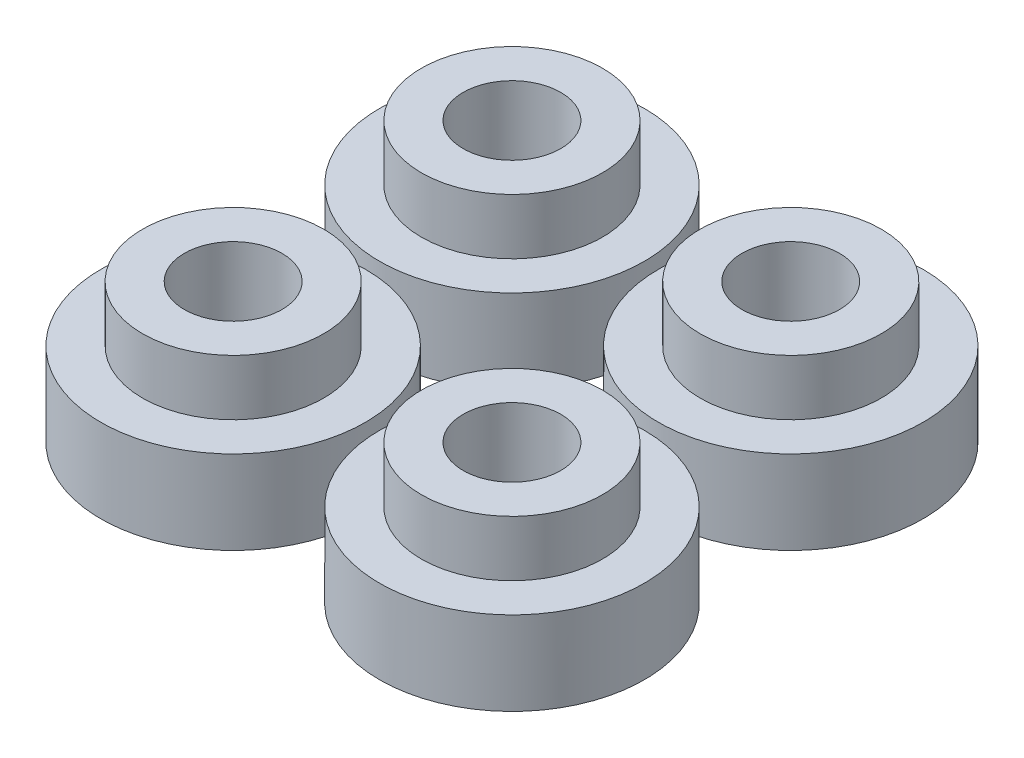
ISO-10303-21;
HEADER;
FILE_DESCRIPTION(('STEP AP214'),'2;1');
FILE_NAME('part.step','',(''),(''),'','','');
FILE_SCHEMA(('AUTOMOTIVE_DESIGN { 1 0 10303 214 1 1 1 1 }'));
ENDSEC;
DATA;
#1=APPLICATION_CONTEXT('core data for automotive mechanical design processes');
#2=APPLICATION_PROTOCOL_DEFINITION('international standard','automotive_design',2000,#1);
#3=PRODUCT_CONTEXT('',#1,'mechanical');
#4=PRODUCT('Part','Part','',(#3));
#5=PRODUCT_RELATED_PRODUCT_CATEGORY('part','',(#4));
#6=PRODUCT_DEFINITION_FORMATION('','',#4);
#7=PRODUCT_DEFINITION_CONTEXT('part definition',#1,'design');
#8=PRODUCT_DEFINITION('design','',#6,#7);
#9=PRODUCT_DEFINITION_SHAPE('','',#8);
#10=(LENGTH_UNIT() NAMED_UNIT(*) SI_UNIT(.MILLI.,.METRE.));
#11=(NAMED_UNIT(*) PLANE_ANGLE_UNIT() SI_UNIT($,.RADIAN.));
#12=(NAMED_UNIT(*) SI_UNIT($,.STERADIAN.) SOLID_ANGLE_UNIT());
#13=UNCERTAINTY_MEASURE_WITH_UNIT(LENGTH_MEASURE(1.E-05),#10,'distance_accuracy_value','');
#14=(GEOMETRIC_REPRESENTATION_CONTEXT(3) GLOBAL_UNCERTAINTY_ASSIGNED_CONTEXT((#13)) GLOBAL_UNIT_ASSIGNED_CONTEXT((#10,
#11,#12)) REPRESENTATION_CONTEXT('',''));
#15=CARTESIAN_POINT('',(0.,0.,0.));
#16=DIRECTION('',(0.,0.,1.));
#17=DIRECTION('',(1.,0.,0.));
#18=AXIS2_PLACEMENT_3D('',#15,#16,#17);
#19=CARTESIAN_POINT('',(4.75,0.,0.));
#20=DIRECTION('',(0.,-1.,0.));
#21=DIRECTION('',(0.,0.,-1.));
#22=AXIS2_PLACEMENT_3D('',#19,#20,#21);
#23=PLANE('',#22);
#24=CARTESIAN_POINT('',(0.,0.,0.));
#25=DIRECTION('',(0.,-1.,0.));
#26=DIRECTION('',(0.,0.,-1.));
#27=AXIS2_PLACEMENT_3D('',#24,#25,#26);
#28=CIRCLE('',#27,1.75);
#29=CARTESIAN_POINT('',(0.,0.,-1.75));
#30=VERTEX_POINT('',#29);
#31=EDGE_CURVE('E59',#30,#30,#28,.T.);
#32=ORIENTED_EDGE('',*,*,#31,.F.);
#33=EDGE_LOOP('',(#32));
#34=FACE_BOUND('',#33,.T.);
#35=CARTESIAN_POINT('',(0.,0.,0.));
#36=DIRECTION('',(0.,-1.,0.));
#37=DIRECTION('',(0.,0.,-1.));
#38=AXIS2_PLACEMENT_3D('',#35,#36,#37);
#39=CIRCLE('',#38,4.75);
#40=CARTESIAN_POINT('',(0.,0.,-4.75));
#41=VERTEX_POINT('',#40);
#42=EDGE_CURVE('E43',#41,#41,#39,.T.);
#43=ORIENTED_EDGE('',*,*,#42,.T.);
#44=EDGE_LOOP('',(#43));
#45=FACE_BOUND('',#44,.T.);
#46=ADVANCED_FACE('F39',(#34,#45),#23,.T.);
#47=CARTESIAN_POINT('',(0.,0.,0.));
#48=DIRECTION('',(0.,-1.,0.));
#49=DIRECTION('',(0.,0.,-1.));
#50=AXIS2_PLACEMENT_3D('',#47,#48,#49);
#51=CYLINDRICAL_SURFACE('',#50,1.75);
#52=ORIENTED_EDGE('',*,*,#31,.T.);
#53=EDGE_LOOP('',(#52));
#54=FACE_BOUND('',#53,.T.);
#55=CARTESIAN_POINT('',(0.,5.,0.));
#56=DIRECTION('',(0.,-1.,0.));
#57=DIRECTION('',(0.,0.,-1.));
#58=AXIS2_PLACEMENT_3D('',#55,#56,#57);
#59=CIRCLE('',#58,1.75);
#60=CARTESIAN_POINT('',(0.,5.,-1.75));
#61=VERTEX_POINT('',#60);
#62=EDGE_CURVE('E56',#61,#61,#59,.T.);
#63=ORIENTED_EDGE('',*,*,#62,.F.);
#64=EDGE_LOOP('',(#63));
#65=FACE_BOUND('',#64,.T.);
#66=ADVANCED_FACE('F75',(#54,#65),#51,.F.);
#67=CARTESIAN_POINT('',(1.75,5.,0.));
#68=DIRECTION('',(0.,1.,0.));
#69=DIRECTION('',(0.,0.,1.));
#70=AXIS2_PLACEMENT_3D('',#67,#68,#69);
#71=PLANE('',#70);
#72=ORIENTED_EDGE('',*,*,#62,.T.);
#73=EDGE_LOOP('',(#72));
#74=FACE_BOUND('',#73,.T.);
#75=CARTESIAN_POINT('',(0.,5.,0.));
#76=DIRECTION('',(0.,-1.,0.));
#77=DIRECTION('',(0.,0.,-1.));
#78=AXIS2_PLACEMENT_3D('',#75,#76,#77);
#79=CIRCLE('',#78,3.25);
#80=CARTESIAN_POINT('',(0.,5.,-3.25));
#81=VERTEX_POINT('',#80);
#82=EDGE_CURVE('E51',#81,#81,#79,.T.);
#83=ORIENTED_EDGE('',*,*,#82,.F.);
#84=EDGE_LOOP('',(#83));
#85=FACE_BOUND('',#84,.T.);
#86=ADVANCED_FACE('F81',(#74,#85),#71,.T.);
#87=CARTESIAN_POINT('',(0.,0.,0.));
#88=DIRECTION('',(0.,-1.,0.));
#89=DIRECTION('',(0.,0.,-1.));
#90=AXIS2_PLACEMENT_3D('',#87,#88,#89);
#91=CYLINDRICAL_SURFACE('',#90,3.25);
#92=ORIENTED_EDGE('',*,*,#82,.T.);
#93=EDGE_LOOP('',(#92));
#94=FACE_BOUND('',#93,.T.);
#95=CARTESIAN_POINT('',(0.,3.,0.));
#96=DIRECTION('',(0.,-1.,0.));
#97=DIRECTION('',(0.,0.,-1.));
#98=AXIS2_PLACEMENT_3D('',#95,#96,#97);
#99=CIRCLE('',#98,3.25);
#100=CARTESIAN_POINT('',(0.,3.,-3.25));
#101=VERTEX_POINT('',#100);
#102=EDGE_CURVE('E47',#101,#101,#99,.T.);
#103=ORIENTED_EDGE('',*,*,#102,.F.);
#104=EDGE_LOOP('',(#103));
#105=FACE_BOUND('',#104,.T.);
#106=ADVANCED_FACE('F72',(#94,#105),#91,.T.);
#107=CARTESIAN_POINT('',(3.25,3.,0.));
#108=DIRECTION('',(0.,1.,0.));
#109=DIRECTION('',(0.,0.,1.));
#110=AXIS2_PLACEMENT_3D('',#107,#108,#109);
#111=PLANE('',#110);
#112=ORIENTED_EDGE('',*,*,#102,.T.);
#113=EDGE_LOOP('',(#112));
#114=FACE_BOUND('',#113,.T.);
#115=CARTESIAN_POINT('',(0.,3.,0.));
#116=DIRECTION('',(0.,-1.,0.));
#117=DIRECTION('',(0.,0.,-1.));
#118=AXIS2_PLACEMENT_3D('',#115,#116,#117);
#119=CIRCLE('',#118,4.75);
#120=CARTESIAN_POINT('',(0.,3.,-4.75));
#121=VERTEX_POINT('',#120);
#122=EDGE_CURVE('E11',#121,#121,#119,.T.);
#123=ORIENTED_EDGE('',*,*,#122,.F.);
#124=EDGE_LOOP('',(#123));
#125=FACE_BOUND('',#124,.T.);
#126=ADVANCED_FACE('F68',(#114,#125),#111,.T.);
#127=CARTESIAN_POINT('',(0.,0.,0.));
#128=DIRECTION('',(0.,-1.,0.));
#129=DIRECTION('',(0.,0.,-1.));
#130=AXIS2_PLACEMENT_3D('',#127,#128,#129);
#131=CYLINDRICAL_SURFACE('',#130,4.75);
#132=ORIENTED_EDGE('',*,*,#122,.T.);
#133=EDGE_LOOP('',(#132));
#134=FACE_BOUND('',#133,.T.);
#135=ORIENTED_EDGE('',*,*,#42,.F.);
#136=EDGE_LOOP('',(#135));
#137=FACE_BOUND('',#136,.T.);
#138=ADVANCED_FACE('F41',(#134,#137),#131,.T.);
#139=CLOSED_SHELL('',(#46,#66,#86,#106,#126,#138));
#140=MANIFOLD_SOLID_BREP('B2',#139);
#141=CARTESIAN_POINT('',(10.,0.,10.));
#142=DIRECTION('',(0.,-1.,0.));
#143=DIRECTION('',(0.,0.,-1.));
#144=AXIS2_PLACEMENT_3D('',#141,#142,#143);
#145=CYLINDRICAL_SURFACE('',#144,3.25);
#146=CARTESIAN_POINT('',(10.,5.,10.));
#147=DIRECTION('',(0.,-1.,0.));
#148=DIRECTION('',(0.,0.,-1.));
#149=AXIS2_PLACEMENT_3D('',#146,#147,#148);
#150=CIRCLE('',#149,3.25);
#151=CARTESIAN_POINT('',(10.,5.,6.75));
#152=VERTEX_POINT('',#151);
#153=EDGE_CURVE('E161',#152,#152,#150,.T.);
#154=ORIENTED_EDGE('',*,*,#153,.T.);
#155=EDGE_LOOP('',(#154));
#156=FACE_BOUND('',#155,.T.);
#157=CARTESIAN_POINT('',(10.,3.,10.));
#158=DIRECTION('',(0.,-1.,0.));
#159=DIRECTION('',(0.,0.,-1.));
#160=AXIS2_PLACEMENT_3D('',#157,#158,#159);
#161=CIRCLE('',#160,3.25);
#162=CARTESIAN_POINT('',(10.,3.,6.75));
#163=VERTEX_POINT('',#162);
#164=EDGE_CURVE('E157',#163,#163,#161,.T.);
#165=ORIENTED_EDGE('',*,*,#164,.F.);
#166=EDGE_LOOP('',(#165));
#167=FACE_BOUND('',#166,.T.);
#168=ADVANCED_FACE('F141',(#156,#167),#145,.T.);
#169=CARTESIAN_POINT('',(11.75,5.,10.));
#170=DIRECTION('',(0.,1.,0.));
#171=DIRECTION('',(0.,0.,1.));
#172=AXIS2_PLACEMENT_3D('',#169,#170,#171);
#173=PLANE('',#172);
#174=CARTESIAN_POINT('',(10.,5.,10.));
#175=DIRECTION('',(0.,-1.,0.));
#176=DIRECTION('',(0.,0.,-1.));
#177=AXIS2_PLACEMENT_3D('',#174,#175,#176);
#178=CIRCLE('',#177,1.75);
#179=CARTESIAN_POINT('',(10.,5.,8.25));
#180=VERTEX_POINT('',#179);
#181=EDGE_CURVE('E158',#180,#180,#178,.T.);
#182=ORIENTED_EDGE('',*,*,#181,.T.);
#183=EDGE_LOOP('',(#182));
#184=FACE_BOUND('',#183,.T.);
#185=ORIENTED_EDGE('',*,*,#153,.F.);
#186=EDGE_LOOP('',(#185));
#187=FACE_BOUND('',#186,.T.);
#188=ADVANCED_FACE('F170',(#184,#187),#173,.T.);
#189=CARTESIAN_POINT('',(13.25,3.,10.));
#190=DIRECTION('',(0.,1.,0.));
#191=DIRECTION('',(0.,0.,1.));
#192=AXIS2_PLACEMENT_3D('',#189,#190,#191);
#193=PLANE('',#192);
#194=ORIENTED_EDGE('',*,*,#164,.T.);
#195=EDGE_LOOP('',(#194));
#196=FACE_BOUND('',#195,.T.);
#197=CARTESIAN_POINT('',(10.,3.,10.));
#198=DIRECTION('',(0.,-1.,0.));
#199=DIRECTION('',(0.,0.,-1.));
#200=AXIS2_PLACEMENT_3D('',#197,#198,#199);
#201=CIRCLE('',#200,4.75);
#202=CARTESIAN_POINT('',(10.,3.,5.25));
#203=VERTEX_POINT('',#202);
#204=EDGE_CURVE('E145',#203,#203,#201,.T.);
#205=ORIENTED_EDGE('',*,*,#204,.F.);
#206=EDGE_LOOP('',(#205));
#207=FACE_BOUND('',#206,.T.);
#208=ADVANCED_FACE('F166',(#196,#207),#193,.T.);
#209=CARTESIAN_POINT('',(10.,0.,10.));
#210=DIRECTION('',(0.,-1.,0.));
#211=DIRECTION('',(0.,0.,-1.));
#212=AXIS2_PLACEMENT_3D('',#209,#210,#211);
#213=CYLINDRICAL_SURFACE('',#212,1.75);
#214=CARTESIAN_POINT('',(10.,0.,10.));
#215=DIRECTION('',(0.,-1.,0.));
#216=DIRECTION('',(0.,0.,-1.));
#217=AXIS2_PLACEMENT_3D('',#214,#215,#216);
#218=CIRCLE('',#217,1.75);
#219=CARTESIAN_POINT('',(10.,0.,8.25));
#220=VERTEX_POINT('',#219);
#221=EDGE_CURVE('E153',#220,#220,#218,.T.);
#222=ORIENTED_EDGE('',*,*,#221,.T.);
#223=EDGE_LOOP('',(#222));
#224=FACE_BOUND('',#223,.T.);
#225=ORIENTED_EDGE('',*,*,#181,.F.);
#226=EDGE_LOOP('',(#225));
#227=FACE_BOUND('',#226,.T.);
#228=ADVANCED_FACE('F180',(#224,#227),#213,.F.);
#229=CARTESIAN_POINT('',(10.,0.,10.));
#230=DIRECTION('',(0.,-1.,0.));
#231=DIRECTION('',(0.,0.,-1.));
#232=AXIS2_PLACEMENT_3D('',#229,#230,#231);
#233=CYLINDRICAL_SURFACE('',#232,4.75);
#234=ORIENTED_EDGE('',*,*,#204,.T.);
#235=EDGE_LOOP('',(#234));
#236=FACE_BOUND('',#235,.T.);
#237=CARTESIAN_POINT('',(10.,0.,10.));
#238=DIRECTION('',(0.,1.,0.));
#239=DIRECTION('',(0.,0.,1.));
#240=AXIS2_PLACEMENT_3D('',#237,#238,#239);
#241=CIRCLE('',#240,4.75);
#242=CARTESIAN_POINT('',(10.,0.,14.75));
#243=VERTEX_POINT('',#242);
#244=EDGE_CURVE('E38',#243,#243,#241,.T.);
#245=ORIENTED_EDGE('',*,*,#244,.T.);
#246=EDGE_LOOP('',(#245));
#247=FACE_BOUND('',#246,.T.);
#248=ADVANCED_FACE('F143',(#236,#247),#233,.T.);
#249=CARTESIAN_POINT('',(14.75,0.,10.));
#250=DIRECTION('',(0.,-1.,0.));
#251=DIRECTION('',(0.,0.,-1.));
#252=AXIS2_PLACEMENT_3D('',#249,#250,#251);
#253=PLANE('',#252);
#254=ORIENTED_EDGE('',*,*,#244,.F.);
#255=EDGE_LOOP('',(#254));
#256=FACE_BOUND('',#255,.T.);
#257=ORIENTED_EDGE('',*,*,#221,.F.);
#258=EDGE_LOOP('',(#257));
#259=FACE_BOUND('',#258,.T.);
#260=ADVANCED_FACE('F188',(#256,#259),#253,.T.);
#261=CLOSED_SHELL('',(#168,#188,#208,#228,#248,#260));
#262=MANIFOLD_SOLID_BREP('B6',#261);
#263=CARTESIAN_POINT('',(0.,0.,10.));
#264=DIRECTION('',(0.,-1.,0.));
#265=DIRECTION('',(0.,0.,-1.));
#266=AXIS2_PLACEMENT_3D('',#263,#264,#265);
#267=CYLINDRICAL_SURFACE('',#266,3.25);
#268=CARTESIAN_POINT('',(0.,5.,10.));
#269=DIRECTION('',(0.,-1.,0.));
#270=DIRECTION('',(0.,0.,-1.));
#271=AXIS2_PLACEMENT_3D('',#268,#269,#270);
#272=CIRCLE('',#271,3.25);
#273=CARTESIAN_POINT('',(0.,5.,6.75));
#274=VERTEX_POINT('',#273);
#275=EDGE_CURVE('E263',#274,#274,#272,.T.);
#276=ORIENTED_EDGE('',*,*,#275,.T.);
#277=EDGE_LOOP('',(#276));
#278=FACE_BOUND('',#277,.T.);
#279=CARTESIAN_POINT('',(0.,3.,10.));
#280=DIRECTION('',(0.,-1.,0.));
#281=DIRECTION('',(0.,0.,-1.));
#282=AXIS2_PLACEMENT_3D('',#279,#280,#281);
#283=CIRCLE('',#282,3.25);
#284=CARTESIAN_POINT('',(0.,3.,6.75));
#285=VERTEX_POINT('',#284);
#286=EDGE_CURVE('E258',#285,#285,#283,.T.);
#287=ORIENTED_EDGE('',*,*,#286,.F.);
#288=EDGE_LOOP('',(#287));
#289=FACE_BOUND('',#288,.T.);
#290=ADVANCED_FACE('F242',(#278,#289),#267,.T.);
#291=CARTESIAN_POINT('',(1.75,5.,10.));
#292=DIRECTION('',(0.,1.,0.));
#293=DIRECTION('',(0.,0.,1.));
#294=AXIS2_PLACEMENT_3D('',#291,#292,#293);
#295=PLANE('',#294);
#296=CARTESIAN_POINT('',(0.,5.,10.));
#297=DIRECTION('',(0.,-1.,0.));
#298=DIRECTION('',(0.,0.,-1.));
#299=AXIS2_PLACEMENT_3D('',#296,#297,#298);
#300=CIRCLE('',#299,1.75);
#301=CARTESIAN_POINT('',(0.,5.,8.25));
#302=VERTEX_POINT('',#301);
#303=EDGE_CURVE('E260',#302,#302,#300,.T.);
#304=ORIENTED_EDGE('',*,*,#303,.T.);
#305=EDGE_LOOP('',(#304));
#306=FACE_BOUND('',#305,.T.);
#307=ORIENTED_EDGE('',*,*,#275,.F.);
#308=EDGE_LOOP('',(#307));
#309=FACE_BOUND('',#308,.T.);
#310=ADVANCED_FACE('F273',(#306,#309),#295,.T.);
#311=CARTESIAN_POINT('',(3.25,3.,10.));
#312=DIRECTION('',(0.,1.,0.));
#313=DIRECTION('',(0.,0.,1.));
#314=AXIS2_PLACEMENT_3D('',#311,#312,#313);
#315=PLANE('',#314);
#316=ORIENTED_EDGE('',*,*,#286,.T.);
#317=EDGE_LOOP('',(#316));
#318=FACE_BOUND('',#317,.T.);
#319=CARTESIAN_POINT('',(0.,3.,10.));
#320=DIRECTION('',(0.,-1.,0.));
#321=DIRECTION('',(0.,0.,-1.));
#322=AXIS2_PLACEMENT_3D('',#319,#320,#321);
#323=CIRCLE('',#322,4.75);
#324=CARTESIAN_POINT('',(0.,3.,5.25));
#325=VERTEX_POINT('',#324);
#326=EDGE_CURVE('E253',#325,#325,#323,.T.);
#327=ORIENTED_EDGE('',*,*,#326,.F.);
#328=EDGE_LOOP('',(#327));
#329=FACE_BOUND('',#328,.T.);
#330=ADVANCED_FACE('F269',(#318,#329),#315,.T.);
#331=CARTESIAN_POINT('',(0.,0.,10.));
#332=DIRECTION('',(0.,-1.,0.));
#333=DIRECTION('',(0.,0.,-1.));
#334=AXIS2_PLACEMENT_3D('',#331,#332,#333);
#335=CYLINDRICAL_SURFACE('',#334,4.75);
#336=ORIENTED_EDGE('',*,*,#326,.T.);
#337=EDGE_LOOP('',(#336));
#338=FACE_BOUND('',#337,.T.);
#339=CARTESIAN_POINT('',(0.,0.,10.));
#340=DIRECTION('',(0.,-1.,0.));
#341=DIRECTION('',(0.,0.,-1.));
#342=AXIS2_PLACEMENT_3D('',#339,#340,#341);
#343=CIRCLE('',#342,4.75);
#344=CARTESIAN_POINT('',(0.,0.,5.25));
#345=VERTEX_POINT('',#344);
#346=EDGE_CURVE('E140',#345,#345,#343,.T.);
#347=ORIENTED_EDGE('',*,*,#346,.F.);
#348=EDGE_LOOP('',(#347));
#349=FACE_BOUND('',#348,.T.);
#350=ADVANCED_FACE('F244',(#338,#349),#335,.T.);
#351=CARTESIAN_POINT('',(0.,0.,10.));
#352=DIRECTION('',(0.,-1.,0.));
#353=DIRECTION('',(0.,0.,-1.));
#354=AXIS2_PLACEMENT_3D('',#351,#352,#353);
#355=CYLINDRICAL_SURFACE('',#354,1.75);
#356=CARTESIAN_POINT('',(0.,0.,10.));
#357=DIRECTION('',(0.,-1.,0.));
#358=DIRECTION('',(0.,0.,-1.));
#359=AXIS2_PLACEMENT_3D('',#356,#357,#358);
#360=CIRCLE('',#359,1.75);
#361=CARTESIAN_POINT('',(0.,0.,8.25));
#362=VERTEX_POINT('',#361);
#363=EDGE_CURVE('E249',#362,#362,#360,.T.);
#364=ORIENTED_EDGE('',*,*,#363,.T.);
#365=EDGE_LOOP('',(#364));
#366=FACE_BOUND('',#365,.T.);
#367=ORIENTED_EDGE('',*,*,#303,.F.);
#368=EDGE_LOOP('',(#367));
#369=FACE_BOUND('',#368,.T.);
#370=ADVANCED_FACE('F286',(#366,#369),#355,.F.);
#371=CARTESIAN_POINT('',(4.75,0.,10.));
#372=DIRECTION('',(0.,-1.,0.));
#373=DIRECTION('',(0.,0.,-1.));
#374=AXIS2_PLACEMENT_3D('',#371,#372,#373);
#375=PLANE('',#374);
#376=ORIENTED_EDGE('',*,*,#363,.F.);
#377=EDGE_LOOP('',(#376));
#378=FACE_BOUND('',#377,.T.);
#379=ORIENTED_EDGE('',*,*,#346,.T.);
#380=EDGE_LOOP('',(#379));
#381=FACE_BOUND('',#380,.T.);
#382=ADVANCED_FACE('F291',(#378,#381),#375,.T.);
#383=CLOSED_SHELL('',(#290,#310,#330,#350,#370,#382));
#384=MANIFOLD_SOLID_BREP('B33',#383);
#385=CARTESIAN_POINT('',(10.,0.,0.));
#386=DIRECTION('',(0.,-1.,0.));
#387=DIRECTION('',(0.,0.,-1.));
#388=AXIS2_PLACEMENT_3D('',#385,#386,#387);
#389=CYLINDRICAL_SURFACE('',#388,3.25);
#390=CARTESIAN_POINT('',(10.,5.,0.));
#391=DIRECTION('',(0.,-1.,0.));
#392=DIRECTION('',(0.,0.,-1.));
#393=AXIS2_PLACEMENT_3D('',#390,#391,#392);
#394=CIRCLE('',#393,3.25);
#395=CARTESIAN_POINT('',(10.,5.,-3.25));
#396=VERTEX_POINT('',#395);
#397=EDGE_CURVE('E347',#396,#396,#394,.T.);
#398=ORIENTED_EDGE('',*,*,#397,.T.);
#399=EDGE_LOOP('',(#398));
#400=FACE_BOUND('',#399,.T.);
#401=CARTESIAN_POINT('',(10.,3.,0.));
#402=DIRECTION('',(0.,-1.,0.));
#403=DIRECTION('',(0.,0.,-1.));
#404=AXIS2_PLACEMENT_3D('',#401,#402,#403);
#405=CIRCLE('',#404,3.25);
#406=CARTESIAN_POINT('',(10.,3.,-3.25));
#407=VERTEX_POINT('',#406);
#408=EDGE_CURVE('E351',#407,#407,#405,.T.);
#409=ORIENTED_EDGE('',*,*,#408,.F.);
#410=EDGE_LOOP('',(#409));
#411=FACE_BOUND('',#410,.T.);
#412=ADVANCED_FACE('F336',(#400,#411),#389,.T.);
#413=CARTESIAN_POINT('',(11.75,5.,0.));
#414=DIRECTION('',(0.,1.,0.));
#415=DIRECTION('',(0.,0.,1.));
#416=AXIS2_PLACEMENT_3D('',#413,#414,#415);
#417=PLANE('',#416);
#418=CARTESIAN_POINT('',(10.,5.,0.));
#419=DIRECTION('',(0.,-1.,0.));
#420=DIRECTION('',(0.,0.,-1.));
#421=AXIS2_PLACEMENT_3D('',#418,#419,#420);
#422=CIRCLE('',#421,1.75);
#423=CARTESIAN_POINT('',(10.,5.,-1.75));
#424=VERTEX_POINT('',#423);
#425=EDGE_CURVE('E343',#424,#424,#422,.T.);
#426=ORIENTED_EDGE('',*,*,#425,.T.);
#427=EDGE_LOOP('',(#426));
#428=FACE_BOUND('',#427,.T.);
#429=ORIENTED_EDGE('',*,*,#397,.F.);
#430=EDGE_LOOP('',(#429));
#431=FACE_BOUND('',#430,.T.);
#432=ADVANCED_FACE('F377',(#428,#431),#417,.T.);
#433=CARTESIAN_POINT('',(13.25,3.,0.));
#434=DIRECTION('',(0.,1.,0.));
#435=DIRECTION('',(0.,0.,1.));
#436=AXIS2_PLACEMENT_3D('',#433,#434,#435);
#437=PLANE('',#436);
#438=ORIENTED_EDGE('',*,*,#408,.T.);
#439=EDGE_LOOP('',(#438));
#440=FACE_BOUND('',#439,.T.);
#441=CARTESIAN_POINT('',(10.,3.,0.));
#442=DIRECTION('',(0.,-1.,0.));
#443=DIRECTION('',(0.,0.,-1.));
#444=AXIS2_PLACEMENT_3D('',#441,#442,#443);
#445=CIRCLE('',#444,4.75);
#446=CARTESIAN_POINT('',(10.,3.,-4.75));
#447=VERTEX_POINT('',#446);
#448=EDGE_CURVE('E356',#447,#447,#445,.T.);
#449=ORIENTED_EDGE('',*,*,#448,.F.);
#450=EDGE_LOOP('',(#449));
#451=FACE_BOUND('',#450,.T.);
#452=ADVANCED_FACE('F374',(#440,#451),#437,.T.);
#453=CARTESIAN_POINT('',(10.,0.,0.));
#454=DIRECTION('',(0.,-1.,0.));
#455=DIRECTION('',(0.,0.,-1.));
#456=AXIS2_PLACEMENT_3D('',#453,#454,#455);
#457=CYLINDRICAL_SURFACE('',#456,1.75);
#458=CARTESIAN_POINT('',(10.,0.,0.));
#459=DIRECTION('',(0.,-1.,0.));
#460=DIRECTION('',(0.,0.,-1.));
#461=AXIS2_PLACEMENT_3D('',#458,#459,#460);
#462=CIRCLE('',#461,1.75);
#463=CARTESIAN_POINT('',(10.,0.,-1.75));
#464=VERTEX_POINT('',#463);
#465=EDGE_CURVE('E241',#464,#464,#462,.T.);
#466=ORIENTED_EDGE('',*,*,#465,.T.);
#467=EDGE_LOOP('',(#466));
#468=FACE_BOUND('',#467,.T.);
#469=ORIENTED_EDGE('',*,*,#425,.F.);
#470=EDGE_LOOP('',(#469));
#471=FACE_BOUND('',#470,.T.);
#472=ADVANCED_FACE('F367',(#468,#471),#457,.F.);
#473=CARTESIAN_POINT('',(10.,0.,0.));
#474=DIRECTION('',(0.,-1.,0.));
#475=DIRECTION('',(0.,0.,-1.));
#476=AXIS2_PLACEMENT_3D('',#473,#474,#475);
#477=CYLINDRICAL_SURFACE('',#476,4.75);
#478=ORIENTED_EDGE('',*,*,#448,.T.);
#479=EDGE_LOOP('',(#478));
#480=FACE_BOUND('',#479,.T.);
#481=CARTESIAN_POINT('',(10.,0.,0.));
#482=DIRECTION('',(0.,-1.,0.));
#483=DIRECTION('',(0.,0.,-1.));
#484=AXIS2_PLACEMENT_3D('',#481,#482,#483);
#485=CIRCLE('',#484,4.75);
#486=CARTESIAN_POINT('',(10.,0.,-4.75));
#487=VERTEX_POINT('',#486);
#488=EDGE_CURVE('E359',#487,#487,#485,.T.);
#489=ORIENTED_EDGE('',*,*,#488,.F.);
#490=EDGE_LOOP('',(#489));
#491=FACE_BOUND('',#490,.T.);
#492=ADVANCED_FACE('F365',(#480,#491),#477,.T.);
#493=CARTESIAN_POINT('',(14.75,0.,0.));
#494=DIRECTION('',(0.,-1.,0.));
#495=DIRECTION('',(0.,0.,-1.));
#496=AXIS2_PLACEMENT_3D('',#493,#494,#495);
#497=PLANE('',#496);
#498=ORIENTED_EDGE('',*,*,#488,.T.);
#499=EDGE_LOOP('',(#498));
#500=FACE_BOUND('',#499,.T.);
#501=ORIENTED_EDGE('',*,*,#465,.F.);
#502=EDGE_LOOP('',(#501));
#503=FACE_BOUND('',#502,.T.);
#504=ADVANCED_FACE('F338',(#500,#503),#497,.T.);
#505=CLOSED_SHELL('',(#412,#432,#452,#472,#492,#504));
#506=MANIFOLD_SOLID_BREP('B135',#505);
#507=ADVANCED_BREP_SHAPE_REPRESENTATION('',(#18,#140,#262,#384,#506),#14);
#508=SHAPE_DEFINITION_REPRESENTATION(#9,#507);
ENDSEC;
END-ISO-10303-21;
